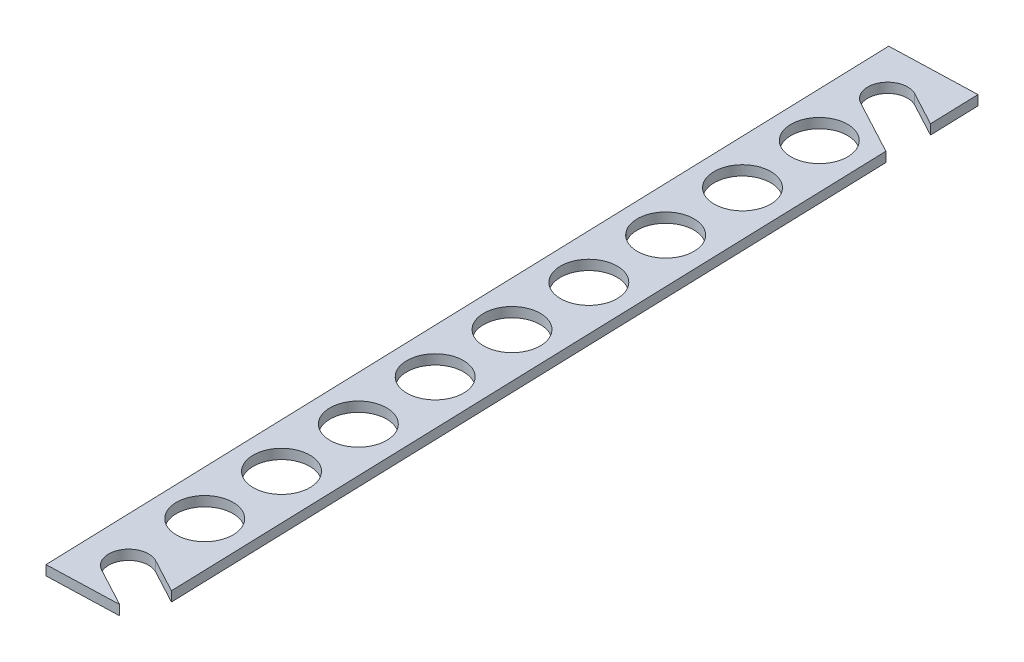
ISO-10303-21;
HEADER;
FILE_DESCRIPTION(('STEP AP214'),'2;1');
FILE_NAME('part.step','',(''),(''),'','','');
FILE_SCHEMA(('AUTOMOTIVE_DESIGN { 1 0 10303 214 1 1 1 1 }'));
ENDSEC;
DATA;
#1=APPLICATION_CONTEXT('core data for automotive mechanical design processes');
#2=APPLICATION_PROTOCOL_DEFINITION('international standard','automotive_design',2000,#1);
#3=PRODUCT_CONTEXT('',#1,'mechanical');
#4=PRODUCT('Part','Part','',(#3));
#5=PRODUCT_RELATED_PRODUCT_CATEGORY('part','',(#4));
#6=PRODUCT_DEFINITION_FORMATION('','',#4);
#7=PRODUCT_DEFINITION_CONTEXT('part definition',#1,'design');
#8=PRODUCT_DEFINITION('design','',#6,#7);
#9=PRODUCT_DEFINITION_SHAPE('','',#8);
#10=(LENGTH_UNIT() NAMED_UNIT(*) SI_UNIT(.MILLI.,.METRE.));
#11=(NAMED_UNIT(*) PLANE_ANGLE_UNIT() SI_UNIT($,.RADIAN.));
#12=(NAMED_UNIT(*) SI_UNIT($,.STERADIAN.) SOLID_ANGLE_UNIT());
#13=UNCERTAINTY_MEASURE_WITH_UNIT(LENGTH_MEASURE(1.E-05),#10,'distance_accuracy_value','');
#14=(GEOMETRIC_REPRESENTATION_CONTEXT(3) GLOBAL_UNCERTAINTY_ASSIGNED_CONTEXT((#13)) GLOBAL_UNIT_ASSIGNED_CONTEXT((#10,
#11,#12)) REPRESENTATION_CONTEXT('',''));
#15=CARTESIAN_POINT('',(0.,0.,0.));
#16=DIRECTION('',(0.,0.,1.));
#17=DIRECTION('',(1.,0.,0.));
#18=AXIS2_PLACEMENT_3D('',#15,#16,#17);
#19=CARTESIAN_POINT('',(2.03043209974553,1.5875,63.99656754575));
#20=DIRECTION('',(0.,1.,0.));
#21=DIRECTION('',(0.,0.,1.));
#22=AXIS2_PLACEMENT_3D('',#19,#20,#21);
#23=PLANE('',#22);
#24=CARTESIAN_POINT('',(1.22077445042455,1.5875,38.4772160489935));
#25=DIRECTION('',(0.,1.,0.));
#26=DIRECTION('',(0.,0.,1.));
#27=AXIS2_PLACEMENT_3D('',#24,#25,#26);
#28=CIRCLE('',#27,4.57199999999983);
#29=CARTESIAN_POINT('',(1.22077445042455,1.5875,43.0492160489934));
#30=VERTEX_POINT('',#29);
#31=EDGE_CURVE('E342',#30,#30,#28,.T.);
#32=ORIENTED_EDGE('',*,*,#31,.F.);
#33=EDGE_LOOP('',(#32));
#34=FACE_BOUND('',#33,.T.);
#35=CARTESIAN_POINT('',(0.406924816808177,1.5875,12.8257386829977));
#36=DIRECTION('',(0.,1.,0.));
#37=DIRECTION('',(0.,0.,1.));
#38=AXIS2_PLACEMENT_3D('',#35,#36,#37);
#39=CIRCLE('',#38,4.57199999999941);
#40=CARTESIAN_POINT('',(0.406924816808177,1.5875,17.3977386829971));
#41=VERTEX_POINT('',#40);
#42=EDGE_CURVE('E358',#41,#41,#39,.T.);
#43=ORIENTED_EDGE('',*,*,#42,.F.);
#44=EDGE_LOOP('',(#43));
#45=FACE_BOUND('',#44,.T.);
#46=CARTESIAN_POINT('',(-0.406924816808185,1.5875,-12.8257386829979));
#47=DIRECTION('',(0.,1.,0.));
#48=DIRECTION('',(0.,0.,1.));
#49=AXIS2_PLACEMENT_3D('',#46,#47,#48);
#50=CIRCLE('',#49,4.57199999999983);
#51=CARTESIAN_POINT('',(-0.406924816808185,1.5875,-8.25373868299808));
#52=VERTEX_POINT('',#51);
#53=EDGE_CURVE('E374',#52,#52,#50,.T.);
#54=ORIENTED_EDGE('',*,*,#53,.F.);
#55=EDGE_LOOP('',(#54));
#56=FACE_BOUND('',#55,.T.);
#57=CARTESIAN_POINT('',(-1.22077445042455,1.5875,-38.4772160489937));
#58=DIRECTION('',(0.,1.,0.));
#59=DIRECTION('',(0.,0.,1.));
#60=AXIS2_PLACEMENT_3D('',#57,#58,#59);
#61=CIRCLE('',#60,4.57199999999983);
#62=CARTESIAN_POINT('',(-1.22077445042455,1.5875,-33.9052160489939));
#63=VERTEX_POINT('',#62);
#64=EDGE_CURVE('E390',#63,#63,#61,.T.);
#65=ORIENTED_EDGE('',*,*,#64,.F.);
#66=EDGE_LOOP('',(#65));
#67=FACE_BOUND('',#66,.T.);
#68=DIRECTION('',(0.0317112466545512,0.,0.999497071949495));
#69=VECTOR('',#68,1.);
#70=CARTESIAN_POINT('',(-9.22827801964852,1.5875,-70.1213952260477));
#71=LINE('',#70,#69);
#72=CARTESIAN_POINT('',(-9.22827801964852,1.5875,-70.1213952260477));
#73=VERTEX_POINT('',#72);
#74=CARTESIAN_POINT('',(-4.76468098764465,1.5875,70.5653526792112));
#75=VERTEX_POINT('',#74);
#76=EDGE_CURVE('E191',#73,#75,#71,.T.);
#77=ORIENTED_EDGE('',*,*,#76,.T.);
#78=DIRECTION('',(0.999497071949495,0.,-0.0317112466545519));
#79=VECTOR('',#78,1.);
#80=CARTESIAN_POINT('',(6.77643436913113,1.5875,70.1991853676517));
#81=LINE('',#80,#79);
#82=CARTESIAN_POINT('',(6.77643436913113,1.5875,70.1991853676517));
#83=VERTEX_POINT('',#82);
#84=EDGE_CURVE('E108',#75,#83,#81,.T.);
#85=ORIENTED_EDGE('',*,*,#84,.T.);
#86=DIRECTION('',(-0.881445478643692,0.,-0.472285790786249));
#87=VECTOR('',#86,1.);
#88=CARTESIAN_POINT('',(0.50693259582727,1.5875,66.8399343707587));
#89=LINE('',#88,#87);
#90=CARTESIAN_POINT('',(0.50693259582727,1.5875,66.8399343707587));
#91=VERTEX_POINT('',#90);
#92=EDGE_CURVE('E225',#83,#91,#89,.T.);
#93=ORIENTED_EDGE('',*,*,#92,.T.);
#94=CARTESIAN_POINT('',(2.03043209974553,1.5875,63.99656754575));
#95=DIRECTION('',(0.,-1.,0.));
#96=DIRECTION('',(0.,0.,1.));
#97=AXIS2_PLACEMENT_3D('',#94,#95,#96);
#98=CIRCLE('',#97,3.22579999999994);
#99=CARTESIAN_POINT('',(3.55393160366379,1.5875,61.1532007207412));
#100=VERTEX_POINT('',#99);
#101=EDGE_CURVE('E245',#91,#100,#98,.T.);
#102=ORIENTED_EDGE('',*,*,#101,.T.);
#103=DIRECTION('',(0.881445478643711,0.,0.472285790786214));
#104=VECTOR('',#103,1.);
#105=CARTESIAN_POINT('',(3.55393160366379,1.5875,61.1532007207412));
#106=LINE('',#105,#104);
#107=CARTESIAN_POINT('',(9.03695198303303,1.5875,64.0910484702718));
#108=VERTEX_POINT('',#107);
#109=EDGE_CURVE('E241',#100,#108,#106,.T.);
#110=ORIENTED_EDGE('',*,*,#109,.T.);
#111=DIRECTION('',(-0.0317112466545511,0.,-0.999497071949495));
#112=VECTOR('',#111,1.);
#113=CARTESIAN_POINT('',(5.25259926260422,1.5875,-55.1868059924398));
#114=LINE('',#113,#112);
#115=CARTESIAN_POINT('',(5.25259926260422,1.5875,-55.1868059924398));
#116=VERTEX_POINT('',#115);
#117=EDGE_CURVE('E244',#108,#116,#114,.T.);
#118=ORIENTED_EDGE('',*,*,#117,.T.);
#119=DIRECTION('',(-0.881445478643702,0.,-0.47228579078623));
#120=VECTOR('',#119,1.);
#121=CARTESIAN_POINT('',(-3.51365832041251,1.5875,-59.8838394393655));
#122=LINE('',#121,#120);
#123=CARTESIAN_POINT('',(-3.51365832041251,1.5875,-59.8838394393655));
#124=VERTEX_POINT('',#123);
#125=EDGE_CURVE('E250',#116,#124,#122,.T.);
#126=ORIENTED_EDGE('',*,*,#125,.T.);
#127=CARTESIAN_POINT('',(-1.99015881649426,1.5875,-62.7272062643744));
#128=DIRECTION('',(0.,-1.,0.));
#129=DIRECTION('',(0.,0.,1.));
#130=AXIS2_PLACEMENT_3D('',#127,#128,#129);
#131=CIRCLE('',#130,3.22580000000024);
#132=CARTESIAN_POINT('',(-0.466659312575622,1.5875,-65.5705730893834));
#133=VERTEX_POINT('',#132);
#134=EDGE_CURVE('E136',#124,#133,#131,.T.);
#135=ORIENTED_EDGE('',*,*,#134,.T.);
#136=DIRECTION('',(0.881445478643709,0.,0.472285790786217));
#137=VECTOR('',#136,1.);
#138=CARTESIAN_POINT('',(-0.466659312575564,1.5875,-65.5705730893835));
#139=LINE('',#138,#137);
#140=CARTESIAN_POINT('',(5.01636106679323,1.5875,-62.6327253398531));
#141=VERTEX_POINT('',#140);
#142=EDGE_CURVE('E130',#133,#141,#139,.T.);
#143=ORIENTED_EDGE('',*,*,#142,.T.);
#144=DIRECTION('',(-0.0317112466546072,0.,-0.999497071949493));
#145=VECTOR('',#144,1.);
#146=CARTESIAN_POINT('',(4.7646809876442,1.5875,-70.5653526792114));
#147=LINE('',#146,#145);
#148=CARTESIAN_POINT('',(4.7646809876442,1.5875,-70.5653526792114));
#149=VERTEX_POINT('',#148);
#150=EDGE_CURVE('E134',#141,#149,#147,.T.);
#151=ORIENTED_EDGE('',*,*,#150,.T.);
#152=DIRECTION('',(-0.999497071949495,0.,0.0317112466545512));
#153=VECTOR('',#152,1.);
#154=CARTESIAN_POINT('',(4.7646809876442,1.5875,-70.5653526792114));
#155=LINE('',#154,#153);
#156=EDGE_CURVE('E56',#149,#73,#155,.T.);
#157=ORIENTED_EDGE('',*,*,#156,.T.);
#158=EDGE_LOOP('',(#77,#85,#93,#102,#110,#118,#126,#135,#143,#151,#157));
#159=FACE_BOUND('',#158,.T.);
#160=CARTESIAN_POINT('',(-1.62769926723274,1.5875,-51.3029547319917));
#161=DIRECTION('',(0.,1.,0.));
#162=DIRECTION('',(0.,0.,1.));
#163=AXIS2_PLACEMENT_3D('',#160,#161,#162);
#164=CIRCLE('',#163,4.57199999999983);
#165=CARTESIAN_POINT('',(-1.62769926723274,1.5875,-46.7309547319918));
#166=VERTEX_POINT('',#165);
#167=EDGE_CURVE('E164',#166,#166,#164,.T.);
#168=ORIENTED_EDGE('',*,*,#167,.F.);
#169=EDGE_LOOP('',(#168));
#170=FACE_BOUND('',#169,.T.);
#171=CARTESIAN_POINT('',(-0.813849633616369,1.5875,-25.6514773659958));
#172=DIRECTION('',(0.,1.,0.));
#173=DIRECTION('',(0.,0.,1.));
#174=AXIS2_PLACEMENT_3D('',#171,#172,#173);
#175=CIRCLE('',#174,4.57199999999983);
#176=CARTESIAN_POINT('',(-0.813849633616369,1.5875,-21.079477365996));
#177=VERTEX_POINT('',#176);
#178=EDGE_CURVE('E382',#177,#177,#175,.T.);
#179=ORIENTED_EDGE('',*,*,#178,.F.);
#180=EDGE_LOOP('',(#179));
#181=FACE_BOUND('',#180,.T.);
#182=CARTESIAN_POINT('',(0.,1.5875,0.));
#183=DIRECTION('',(0.,1.,0.));
#184=DIRECTION('',(0.,0.,1.));
#185=AXIS2_PLACEMENT_3D('',#182,#183,#184);
#186=CIRCLE('',#185,4.57199999999983);
#187=CARTESIAN_POINT('',(0.,1.5875,4.57199999999983));
#188=VERTEX_POINT('',#187);
#189=EDGE_CURVE('E366',#188,#188,#186,.T.);
#190=ORIENTED_EDGE('',*,*,#189,.F.);
#191=EDGE_LOOP('',(#190));
#192=FACE_BOUND('',#191,.T.);
#193=CARTESIAN_POINT('',(0.813849633616362,1.5875,25.6514773659956));
#194=DIRECTION('',(0.,1.,0.));
#195=DIRECTION('',(0.,0.,1.));
#196=AXIS2_PLACEMENT_3D('',#193,#194,#195);
#197=CIRCLE('',#196,4.57199999999983);
#198=CARTESIAN_POINT('',(0.813849633616362,1.5875,30.2234773659954));
#199=VERTEX_POINT('',#198);
#200=EDGE_CURVE('E350',#199,#199,#197,.T.);
#201=ORIENTED_EDGE('',*,*,#200,.F.);
#202=EDGE_LOOP('',(#201));
#203=FACE_BOUND('',#202,.T.);
#204=CARTESIAN_POINT('',(1.62769926723273,1.5875,51.3029547319914));
#205=DIRECTION('',(0.,1.,0.));
#206=DIRECTION('',(0.,0.,1.));
#207=AXIS2_PLACEMENT_3D('',#204,#205,#206);
#208=CIRCLE('',#207,4.57199999999983);
#209=CARTESIAN_POINT('',(1.62769926723273,1.5875,55.8749547319913));
#210=VERTEX_POINT('',#209);
#211=EDGE_CURVE('E330',#210,#210,#208,.T.);
#212=ORIENTED_EDGE('',*,*,#211,.F.);
#213=EDGE_LOOP('',(#212));
#214=FACE_BOUND('',#213,.T.);
#215=ADVANCED_FACE('F38',(#34,#45,#56,#67,#159,#170,#181,#192,#203,#214),#23,.T.);
#216=CARTESIAN_POINT('',(2.03043209974553,0.,63.99656754575));
#217=DIRECTION('',(0.,1.,0.));
#218=DIRECTION('',(0.,0.,1.));
#219=AXIS2_PLACEMENT_3D('',#216,#217,#218);
#220=PLANE('',#219);
#221=DIRECTION('',(0.0317112466545512,0.,0.999497071949495));
#222=VECTOR('',#221,1.);
#223=CARTESIAN_POINT('',(-9.22827801964852,0.,-70.1213952260477));
#224=LINE('',#223,#222);
#225=CARTESIAN_POINT('',(-9.22827801964852,0.,-70.1213952260477));
#226=VERTEX_POINT('',#225);
#227=CARTESIAN_POINT('',(-4.76468098764465,0.,70.5653526792112));
#228=VERTEX_POINT('',#227);
#229=EDGE_CURVE('E159',#226,#228,#224,.T.);
#230=ORIENTED_EDGE('',*,*,#229,.F.);
#231=DIRECTION('',(-0.999497071949495,0.,0.0317112466545512));
#232=VECTOR('',#231,1.);
#233=CARTESIAN_POINT('',(4.7646809876442,0.,-70.5653526792114));
#234=LINE('',#233,#232);
#235=CARTESIAN_POINT('',(4.7646809876442,0.,-70.5653526792114));
#236=VERTEX_POINT('',#235);
#237=EDGE_CURVE('E100',#236,#226,#234,.T.);
#238=ORIENTED_EDGE('',*,*,#237,.F.);
#239=DIRECTION('',(-0.0317112466546072,0.,-0.999497071949493));
#240=VECTOR('',#239,1.);
#241=CARTESIAN_POINT('',(4.7646809876442,0.,-70.5653526792114));
#242=LINE('',#241,#240);
#243=CARTESIAN_POINT('',(5.01636106679323,0.,-62.6327253398531));
#244=VERTEX_POINT('',#243);
#245=EDGE_CURVE('E94',#244,#236,#242,.T.);
#246=ORIENTED_EDGE('',*,*,#245,.F.);
#247=DIRECTION('',(0.881445478643709,0.,0.472285790786217));
#248=VECTOR('',#247,1.);
#249=CARTESIAN_POINT('',(-0.466659312575564,0.,-65.5705730893835));
#250=LINE('',#249,#248);
#251=CARTESIAN_POINT('',(-0.466659312575622,0.,-65.5705730893834));
#252=VERTEX_POINT('',#251);
#253=EDGE_CURVE('E145',#252,#244,#250,.T.);
#254=ORIENTED_EDGE('',*,*,#253,.F.);
#255=CARTESIAN_POINT('',(-1.99015881649426,0.,-62.7272062643744));
#256=DIRECTION('',(0.,-1.,0.));
#257=DIRECTION('',(0.,0.,1.));
#258=AXIS2_PLACEMENT_3D('',#255,#256,#257);
#259=CIRCLE('',#258,3.22580000000024);
#260=CARTESIAN_POINT('',(-3.51365832041251,0.,-59.8838394393655));
#261=VERTEX_POINT('',#260);
#262=EDGE_CURVE('E182',#261,#252,#259,.T.);
#263=ORIENTED_EDGE('',*,*,#262,.F.);
#264=DIRECTION('',(-0.881445478643702,0.,-0.47228579078623));
#265=VECTOR('',#264,1.);
#266=CARTESIAN_POINT('',(-3.51365832041251,0.,-59.8838394393655));
#267=LINE('',#266,#265);
#268=CARTESIAN_POINT('',(5.25259926260422,0.,-55.1868059924398));
#269=VERTEX_POINT('',#268);
#270=EDGE_CURVE('E179',#269,#261,#267,.T.);
#271=ORIENTED_EDGE('',*,*,#270,.F.);
#272=DIRECTION('',(-0.0317112466545511,0.,-0.999497071949495));
#273=VECTOR('',#272,1.);
#274=CARTESIAN_POINT('',(5.25259926260422,0.,-55.1868059924398));
#275=LINE('',#274,#273);
#276=CARTESIAN_POINT('',(9.03695198303303,0.,64.0910484702718));
#277=VERTEX_POINT('',#276);
#278=EDGE_CURVE('E176',#277,#269,#275,.T.);
#279=ORIENTED_EDGE('',*,*,#278,.F.);
#280=DIRECTION('',(0.881445478643711,0.,0.472285790786214));
#281=VECTOR('',#280,1.);
#282=CARTESIAN_POINT('',(3.55393160366379,0.,61.1532007207412));
#283=LINE('',#282,#281);
#284=CARTESIAN_POINT('',(3.55393160366379,0.,61.1532007207412));
#285=VERTEX_POINT('',#284);
#286=EDGE_CURVE('E173',#285,#277,#283,.T.);
#287=ORIENTED_EDGE('',*,*,#286,.F.);
#288=CARTESIAN_POINT('',(2.03043209974553,0.,63.99656754575));
#289=DIRECTION('',(0.,-1.,0.));
#290=DIRECTION('',(0.,0.,1.));
#291=AXIS2_PLACEMENT_3D('',#288,#289,#290);
#292=CIRCLE('',#291,3.22579999999994);
#293=CARTESIAN_POINT('',(0.50693259582727,0.,66.8399343707587));
#294=VERTEX_POINT('',#293);
#295=EDGE_CURVE('E170',#294,#285,#292,.T.);
#296=ORIENTED_EDGE('',*,*,#295,.F.);
#297=DIRECTION('',(-0.881445478643692,0.,-0.472285790786249));
#298=VECTOR('',#297,1.);
#299=CARTESIAN_POINT('',(0.50693259582727,0.,66.8399343707587));
#300=LINE('',#299,#298);
#301=CARTESIAN_POINT('',(6.77643436913113,0.,70.1991853676517));
#302=VERTEX_POINT('',#301);
#303=EDGE_CURVE('E167',#302,#294,#300,.T.);
#304=ORIENTED_EDGE('',*,*,#303,.F.);
#305=DIRECTION('',(0.999497071949495,0.,-0.0317112466545519));
#306=VECTOR('',#305,1.);
#307=CARTESIAN_POINT('',(6.77643436913113,0.,70.1991853676517));
#308=LINE('',#307,#306);
#309=EDGE_CURVE('E163',#228,#302,#308,.T.);
#310=ORIENTED_EDGE('',*,*,#309,.F.);
#311=EDGE_LOOP('',(#230,#238,#246,#254,#263,#271,#279,#287,#296,#304,#310));
#312=FACE_BOUND('',#311,.T.);
#313=CARTESIAN_POINT('',(-1.62769926723274,0.,-51.3029547319917));
#314=DIRECTION('',(0.,1.,0.));
#315=DIRECTION('',(0.,0.,1.));
#316=AXIS2_PLACEMENT_3D('',#313,#314,#315);
#317=CIRCLE('',#316,4.57199999999983);
#318=CARTESIAN_POINT('',(-1.62769926723274,0.,-46.7309547319918));
#319=VERTEX_POINT('',#318);
#320=EDGE_CURVE('E394',#319,#319,#317,.T.);
#321=ORIENTED_EDGE('',*,*,#320,.T.);
#322=EDGE_LOOP('',(#321));
#323=FACE_BOUND('',#322,.T.);
#324=CARTESIAN_POINT('',(-1.22077445042455,0.,-38.4772160489937));
#325=DIRECTION('',(0.,1.,0.));
#326=DIRECTION('',(0.,0.,1.));
#327=AXIS2_PLACEMENT_3D('',#324,#325,#326);
#328=CIRCLE('',#327,4.57199999999983);
#329=CARTESIAN_POINT('',(-1.22077445042455,0.,-33.9052160489939));
#330=VERTEX_POINT('',#329);
#331=EDGE_CURVE('E386',#330,#330,#328,.T.);
#332=ORIENTED_EDGE('',*,*,#331,.T.);
#333=EDGE_LOOP('',(#332));
#334=FACE_BOUND('',#333,.T.);
#335=CARTESIAN_POINT('',(-0.813849633616369,0.,-25.6514773659958));
#336=DIRECTION('',(0.,1.,0.));
#337=DIRECTION('',(0.,0.,1.));
#338=AXIS2_PLACEMENT_3D('',#335,#336,#337);
#339=CIRCLE('',#338,4.57199999999983);
#340=CARTESIAN_POINT('',(-0.813849633616369,0.,-21.079477365996));
#341=VERTEX_POINT('',#340);
#342=EDGE_CURVE('E378',#341,#341,#339,.T.);
#343=ORIENTED_EDGE('',*,*,#342,.T.);
#344=EDGE_LOOP('',(#343));
#345=FACE_BOUND('',#344,.T.);
#346=CARTESIAN_POINT('',(-0.406924816808185,0.,-12.8257386829979));
#347=DIRECTION('',(0.,1.,0.));
#348=DIRECTION('',(0.,0.,1.));
#349=AXIS2_PLACEMENT_3D('',#346,#347,#348);
#350=CIRCLE('',#349,4.57199999999983);
#351=CARTESIAN_POINT('',(-0.406924816808185,0.,-8.25373868299808));
#352=VERTEX_POINT('',#351);
#353=EDGE_CURVE('E370',#352,#352,#350,.T.);
#354=ORIENTED_EDGE('',*,*,#353,.T.);
#355=EDGE_LOOP('',(#354));
#356=FACE_BOUND('',#355,.T.);
#357=CARTESIAN_POINT('',(0.,0.,0.));
#358=DIRECTION('',(0.,1.,0.));
#359=DIRECTION('',(0.,0.,1.));
#360=AXIS2_PLACEMENT_3D('',#357,#358,#359);
#361=CIRCLE('',#360,4.57199999999983);
#362=CARTESIAN_POINT('',(0.,0.,4.57199999999983));
#363=VERTEX_POINT('',#362);
#364=EDGE_CURVE('E362',#363,#363,#361,.T.);
#365=ORIENTED_EDGE('',*,*,#364,.T.);
#366=EDGE_LOOP('',(#365));
#367=FACE_BOUND('',#366,.T.);
#368=CARTESIAN_POINT('',(0.406924816808177,0.,12.8257386829977));
#369=DIRECTION('',(0.,1.,0.));
#370=DIRECTION('',(0.,0.,1.));
#371=AXIS2_PLACEMENT_3D('',#368,#369,#370);
#372=CIRCLE('',#371,4.57199999999941);
#373=CARTESIAN_POINT('',(0.406924816808177,0.,17.3977386829971));
#374=VERTEX_POINT('',#373);
#375=EDGE_CURVE('E354',#374,#374,#372,.T.);
#376=ORIENTED_EDGE('',*,*,#375,.T.);
#377=EDGE_LOOP('',(#376));
#378=FACE_BOUND('',#377,.T.);
#379=CARTESIAN_POINT('',(0.813849633616362,0.,25.6514773659956));
#380=DIRECTION('',(0.,1.,0.));
#381=DIRECTION('',(0.,0.,1.));
#382=AXIS2_PLACEMENT_3D('',#379,#380,#381);
#383=CIRCLE('',#382,4.57199999999983);
#384=CARTESIAN_POINT('',(0.813849633616362,0.,30.2234773659954));
#385=VERTEX_POINT('',#384);
#386=EDGE_CURVE('E346',#385,#385,#383,.T.);
#387=ORIENTED_EDGE('',*,*,#386,.T.);
#388=EDGE_LOOP('',(#387));
#389=FACE_BOUND('',#388,.T.);
#390=CARTESIAN_POINT('',(1.22077445042455,0.,38.4772160489935));
#391=DIRECTION('',(0.,1.,0.));
#392=DIRECTION('',(0.,0.,1.));
#393=AXIS2_PLACEMENT_3D('',#390,#391,#392);
#394=CIRCLE('',#393,4.57199999999983);
#395=CARTESIAN_POINT('',(1.22077445042455,0.,43.0492160489934));
#396=VERTEX_POINT('',#395);
#397=EDGE_CURVE('E339',#396,#396,#394,.T.);
#398=ORIENTED_EDGE('',*,*,#397,.T.);
#399=EDGE_LOOP('',(#398));
#400=FACE_BOUND('',#399,.T.);
#401=CARTESIAN_POINT('',(1.62769926723273,0.,51.3029547319914));
#402=DIRECTION('',(0.,1.,0.));
#403=DIRECTION('',(0.,0.,1.));
#404=AXIS2_PLACEMENT_3D('',#401,#402,#403);
#405=CIRCLE('',#404,4.57199999999983);
#406=CARTESIAN_POINT('',(1.62769926723273,0.,55.8749547319913));
#407=VERTEX_POINT('',#406);
#408=EDGE_CURVE('E333',#407,#407,#405,.T.);
#409=ORIENTED_EDGE('',*,*,#408,.T.);
#410=EDGE_LOOP('',(#409));
#411=FACE_BOUND('',#410,.T.);
#412=ADVANCED_FACE('F229',(#312,#323,#334,#345,#356,#367,#378,#389,#400,#411),#220,.F.);
#413=CARTESIAN_POINT('',(-9.22827801964852,1.5875,-70.1213952260477));
#414=DIRECTION('',(0.999497071949495,0.,-0.0317112466545511));
#415=DIRECTION('',(-0.0317112466545512,0.,-0.999497071949495));
#416=AXIS2_PLACEMENT_3D('',#413,#414,#415);
#417=PLANE('',#416);
#418=ORIENTED_EDGE('',*,*,#229,.T.);
#419=DIRECTION('',(0.,-1.,0.));
#420=VECTOR('',#419,1.);
#421=CARTESIAN_POINT('',(-4.76468098764465,1.5875,70.5653526792112));
#422=LINE('',#421,#420);
#423=EDGE_CURVE('E11',#75,#228,#422,.T.);
#424=ORIENTED_EDGE('',*,*,#423,.F.);
#425=ORIENTED_EDGE('',*,*,#76,.F.);
#426=DIRECTION('',(0.,-1.,0.));
#427=VECTOR('',#426,1.);
#428=CARTESIAN_POINT('',(-9.22827801964852,1.5875,-70.1213952260477));
#429=LINE('',#428,#427);
#430=EDGE_CURVE('E155',#73,#226,#429,.T.);
#431=ORIENTED_EDGE('',*,*,#430,.T.);
#432=EDGE_LOOP('',(#418,#424,#425,#431));
#433=FACE_BOUND('',#432,.T.);
#434=ADVANCED_FACE('F40',(#433),#417,.F.);
#435=CARTESIAN_POINT('',(6.77643436913113,1.5875,70.1991853676517));
#436=DIRECTION('',(-0.0317112466545519,0.,-0.999497071949495));
#437=DIRECTION('',(-0.999497071949495,0.,0.0317112466545519));
#438=AXIS2_PLACEMENT_3D('',#435,#436,#437);
#439=PLANE('',#438);
#440=ORIENTED_EDGE('',*,*,#309,.T.);
#441=DIRECTION('',(0.,-1.,0.));
#442=VECTOR('',#441,1.);
#443=CARTESIAN_POINT('',(6.77643436913113,1.5875,70.1991853676517));
#444=LINE('',#443,#442);
#445=EDGE_CURVE('E48',#83,#302,#444,.T.);
#446=ORIENTED_EDGE('',*,*,#445,.F.);
#447=ORIENTED_EDGE('',*,*,#84,.F.);
#448=ORIENTED_EDGE('',*,*,#423,.T.);
#449=EDGE_LOOP('',(#440,#446,#447,#448));
#450=FACE_BOUND('',#449,.T.);
#451=ADVANCED_FACE('F577',(#450),#439,.F.);
#452=CARTESIAN_POINT('',(0.50693259582727,1.5875,66.8399343707587));
#453=DIRECTION('',(-0.472285790786249,0.,0.881445478643692));
#454=DIRECTION('',(0.881445478643692,0.,0.472285790786249));
#455=AXIS2_PLACEMENT_3D('',#452,#453,#454);
#456=PLANE('',#455);
#457=ORIENTED_EDGE('',*,*,#303,.T.);
#458=DIRECTION('',(0.,-1.,0.));
#459=VECTOR('',#458,1.);
#460=CARTESIAN_POINT('',(0.50693259582727,1.5875,66.8399343707587));
#461=LINE('',#460,#459);
#462=EDGE_CURVE('E214',#91,#294,#461,.T.);
#463=ORIENTED_EDGE('',*,*,#462,.F.);
#464=ORIENTED_EDGE('',*,*,#92,.F.);
#465=ORIENTED_EDGE('',*,*,#445,.T.);
#466=EDGE_LOOP('',(#457,#463,#464,#465));
#467=FACE_BOUND('',#466,.T.);
#468=ADVANCED_FACE('F223',(#467),#456,.F.);
#469=CARTESIAN_POINT('',(2.03043209974553,1.5875,63.99656754575));
#470=DIRECTION('',(0.,-1.,0.));
#471=DIRECTION('',(0.,0.,-1.));
#472=AXIS2_PLACEMENT_3D('',#469,#470,#471);
#473=CYLINDRICAL_SURFACE('',#472,3.22579999999994);
#474=ORIENTED_EDGE('',*,*,#295,.T.);
#475=DIRECTION('',(0.,-1.,0.));
#476=VECTOR('',#475,1.);
#477=CARTESIAN_POINT('',(3.55393160366379,1.5875,61.1532007207412));
#478=LINE('',#477,#476);
#479=EDGE_CURVE('E210',#100,#285,#478,.T.);
#480=ORIENTED_EDGE('',*,*,#479,.F.);
#481=ORIENTED_EDGE('',*,*,#101,.F.);
#482=ORIENTED_EDGE('',*,*,#462,.T.);
#483=EDGE_LOOP('',(#474,#480,#481,#482));
#484=FACE_BOUND('',#483,.T.);
#485=ADVANCED_FACE('F235',(#484),#473,.F.);
#486=CARTESIAN_POINT('',(3.55393160366379,1.5875,61.1532007207412));
#487=DIRECTION('',(0.472285790786214,0.,-0.881445478643711));
#488=DIRECTION('',(-0.881445478643711,0.,-0.472285790786214));
#489=AXIS2_PLACEMENT_3D('',#486,#487,#488);
#490=PLANE('',#489);
#491=ORIENTED_EDGE('',*,*,#286,.T.);
#492=DIRECTION('',(0.,-1.,0.));
#493=VECTOR('',#492,1.);
#494=CARTESIAN_POINT('',(9.03695198303303,1.5875,64.0910484702718));
#495=LINE('',#494,#493);
#496=EDGE_CURVE('E206',#108,#277,#495,.T.);
#497=ORIENTED_EDGE('',*,*,#496,.F.);
#498=ORIENTED_EDGE('',*,*,#109,.F.);
#499=ORIENTED_EDGE('',*,*,#479,.T.);
#500=EDGE_LOOP('',(#491,#497,#498,#499));
#501=FACE_BOUND('',#500,.T.);
#502=ADVANCED_FACE('F239',(#501),#490,.F.);
#503=CARTESIAN_POINT('',(5.25259926260422,1.5875,-55.1868059924398));
#504=DIRECTION('',(-0.999497071949495,0.,0.0317112466545511));
#505=DIRECTION('',(0.0317112466545511,0.,0.999497071949495));
#506=AXIS2_PLACEMENT_3D('',#503,#504,#505);
#507=PLANE('',#506);
#508=ORIENTED_EDGE('',*,*,#278,.T.);
#509=DIRECTION('',(0.,-1.,0.));
#510=VECTOR('',#509,1.);
#511=CARTESIAN_POINT('',(5.25259926260422,1.5875,-55.1868059924398));
#512=LINE('',#511,#510);
#513=EDGE_CURVE('E202',#116,#269,#512,.T.);
#514=ORIENTED_EDGE('',*,*,#513,.F.);
#515=ORIENTED_EDGE('',*,*,#117,.F.);
#516=ORIENTED_EDGE('',*,*,#496,.T.);
#517=EDGE_LOOP('',(#508,#514,#515,#516));
#518=FACE_BOUND('',#517,.T.);
#519=ADVANCED_FACE('F543',(#518),#507,.F.);
#520=CARTESIAN_POINT('',(-3.51365832041251,1.5875,-59.8838394393655));
#521=DIRECTION('',(-0.47228579078623,0.,0.881445478643702));
#522=DIRECTION('',(0.881445478643702,0.,0.472285790786231));
#523=AXIS2_PLACEMENT_3D('',#520,#521,#522);
#524=PLANE('',#523);
#525=ORIENTED_EDGE('',*,*,#270,.T.);
#526=DIRECTION('',(0.,-1.,0.));
#527=VECTOR('',#526,1.);
#528=CARTESIAN_POINT('',(-3.51365832041251,1.5875,-59.8838394393655));
#529=LINE('',#528,#527);
#530=EDGE_CURVE('E198',#124,#261,#529,.T.);
#531=ORIENTED_EDGE('',*,*,#530,.F.);
#532=ORIENTED_EDGE('',*,*,#125,.F.);
#533=ORIENTED_EDGE('',*,*,#513,.T.);
#534=EDGE_LOOP('',(#525,#531,#532,#533));
#535=FACE_BOUND('',#534,.T.);
#536=ADVANCED_FACE('F265',(#535),#524,.F.);
#537=CARTESIAN_POINT('',(-1.99015881649426,1.5875,-62.7272062643744));
#538=DIRECTION('',(0.,-1.,0.));
#539=DIRECTION('',(0.,0.,-1.));
#540=AXIS2_PLACEMENT_3D('',#537,#538,#539);
#541=CYLINDRICAL_SURFACE('',#540,3.22580000000024);
#542=ORIENTED_EDGE('',*,*,#262,.T.);
#543=DIRECTION('',(0.,-1.,0.));
#544=VECTOR('',#543,1.);
#545=CARTESIAN_POINT('',(-0.466659312575622,1.5875,-65.5705730893834));
#546=LINE('',#545,#544);
#547=EDGE_CURVE('E147',#133,#252,#546,.T.);
#548=ORIENTED_EDGE('',*,*,#547,.F.);
#549=ORIENTED_EDGE('',*,*,#134,.F.);
#550=ORIENTED_EDGE('',*,*,#530,.T.);
#551=EDGE_LOOP('',(#542,#548,#549,#550));
#552=FACE_BOUND('',#551,.T.);
#553=ADVANCED_FACE('F269',(#552),#541,.F.);
#554=CARTESIAN_POINT('',(-0.466659312575564,1.5875,-65.5705730893835));
#555=DIRECTION('',(0.472285790786217,0.,-0.881445478643709));
#556=DIRECTION('',(-0.881445478643709,0.,-0.472285790786217));
#557=AXIS2_PLACEMENT_3D('',#554,#555,#556);
#558=PLANE('',#557);
#559=ORIENTED_EDGE('',*,*,#253,.T.);
#560=DIRECTION('',(0.,-1.,0.));
#561=VECTOR('',#560,1.);
#562=CARTESIAN_POINT('',(5.01636106679323,1.5875,-62.6327253398531));
#563=LINE('',#562,#561);
#564=EDGE_CURVE('E142',#141,#244,#563,.T.);
#565=ORIENTED_EDGE('',*,*,#564,.F.);
#566=ORIENTED_EDGE('',*,*,#142,.F.);
#567=ORIENTED_EDGE('',*,*,#547,.T.);
#568=EDGE_LOOP('',(#559,#565,#566,#567));
#569=FACE_BOUND('',#568,.T.);
#570=ADVANCED_FACE('F143',(#569),#558,.F.);
#571=CARTESIAN_POINT('',(4.7646809876442,1.5875,-70.5653526792114));
#572=DIRECTION('',(-0.999497071949493,0.,0.0317112466546072));
#573=DIRECTION('',(0.0317112466546072,0.,0.999497071949493));
#574=AXIS2_PLACEMENT_3D('',#571,#572,#573);
#575=PLANE('',#574);
#576=ORIENTED_EDGE('',*,*,#245,.T.);
#577=DIRECTION('',(0.,-1.,0.));
#578=VECTOR('',#577,1.);
#579=CARTESIAN_POINT('',(4.7646809876442,1.5875,-70.5653526792114));
#580=LINE('',#579,#578);
#581=EDGE_CURVE('E148',#149,#236,#580,.T.);
#582=ORIENTED_EDGE('',*,*,#581,.F.);
#583=ORIENTED_EDGE('',*,*,#150,.F.);
#584=ORIENTED_EDGE('',*,*,#564,.T.);
#585=EDGE_LOOP('',(#576,#582,#583,#584));
#586=FACE_BOUND('',#585,.T.);
#587=ADVANCED_FACE('F150',(#586),#575,.F.);
#588=CARTESIAN_POINT('',(4.7646809876442,1.5875,-70.5653526792114));
#589=DIRECTION('',(0.0317112466545512,0.,0.999497071949495));
#590=DIRECTION('',(0.999497071949495,0.,-0.0317112466545512));
#591=AXIS2_PLACEMENT_3D('',#588,#589,#590);
#592=PLANE('',#591);
#593=ORIENTED_EDGE('',*,*,#237,.T.);
#594=ORIENTED_EDGE('',*,*,#430,.F.);
#595=ORIENTED_EDGE('',*,*,#156,.F.);
#596=ORIENTED_EDGE('',*,*,#581,.T.);
#597=EDGE_LOOP('',(#593,#594,#595,#596));
#598=FACE_BOUND('',#597,.T.);
#599=ADVANCED_FACE('F273',(#598),#592,.F.);
#600=CARTESIAN_POINT('',(-1.62769926723274,1.5875,-51.3029547319917));
#601=DIRECTION('',(0.,-1.,0.));
#602=DIRECTION('',(0.,0.,-1.));
#603=AXIS2_PLACEMENT_3D('',#600,#601,#602);
#604=CYLINDRICAL_SURFACE('',#603,4.57199999999983);
#605=ORIENTED_EDGE('',*,*,#167,.T.);
#606=EDGE_LOOP('',(#605));
#607=FACE_BOUND('',#606,.T.);
#608=ORIENTED_EDGE('',*,*,#320,.F.);
#609=EDGE_LOOP('',(#608));
#610=FACE_BOUND('',#609,.T.);
#611=ADVANCED_FACE('F275',(#607,#610),#604,.F.);
#612=CARTESIAN_POINT('',(-1.22077445042455,1.5875,-38.4772160489937));
#613=DIRECTION('',(0.,-1.,0.));
#614=DIRECTION('',(0.,0.,-1.));
#615=AXIS2_PLACEMENT_3D('',#612,#613,#614);
#616=CYLINDRICAL_SURFACE('',#615,4.57199999999983);
#617=ORIENTED_EDGE('',*,*,#64,.T.);
#618=EDGE_LOOP('',(#617));
#619=FACE_BOUND('',#618,.T.);
#620=ORIENTED_EDGE('',*,*,#331,.F.);
#621=EDGE_LOOP('',(#620));
#622=FACE_BOUND('',#621,.T.);
#623=ADVANCED_FACE('F281',(#619,#622),#616,.F.);
#624=CARTESIAN_POINT('',(-0.813849633616369,1.5875,-25.6514773659958));
#625=DIRECTION('',(0.,-1.,0.));
#626=DIRECTION('',(0.,0.,-1.));
#627=AXIS2_PLACEMENT_3D('',#624,#625,#626);
#628=CYLINDRICAL_SURFACE('',#627,4.57199999999983);
#629=ORIENTED_EDGE('',*,*,#178,.T.);
#630=EDGE_LOOP('',(#629));
#631=FACE_BOUND('',#630,.T.);
#632=ORIENTED_EDGE('',*,*,#342,.F.);
#633=EDGE_LOOP('',(#632));
#634=FACE_BOUND('',#633,.T.);
#635=ADVANCED_FACE('F297',(#631,#634),#628,.F.);
#636=CARTESIAN_POINT('',(-0.406924816808185,1.5875,-12.8257386829979));
#637=DIRECTION('',(0.,-1.,0.));
#638=DIRECTION('',(0.,0.,-1.));
#639=AXIS2_PLACEMENT_3D('',#636,#637,#638);
#640=CYLINDRICAL_SURFACE('',#639,4.57199999999983);
#641=ORIENTED_EDGE('',*,*,#53,.T.);
#642=EDGE_LOOP('',(#641));
#643=FACE_BOUND('',#642,.T.);
#644=ORIENTED_EDGE('',*,*,#353,.F.);
#645=EDGE_LOOP('',(#644));
#646=FACE_BOUND('',#645,.T.);
#647=ADVANCED_FACE('F301',(#643,#646),#640,.F.);
#648=CARTESIAN_POINT('',(0.,1.5875,0.));
#649=DIRECTION('',(0.,-1.,0.));
#650=DIRECTION('',(0.,0.,-1.));
#651=AXIS2_PLACEMENT_3D('',#648,#649,#650);
#652=CYLINDRICAL_SURFACE('',#651,4.57199999999983);
#653=ORIENTED_EDGE('',*,*,#189,.T.);
#654=EDGE_LOOP('',(#653));
#655=FACE_BOUND('',#654,.T.);
#656=ORIENTED_EDGE('',*,*,#364,.F.);
#657=EDGE_LOOP('',(#656));
#658=FACE_BOUND('',#657,.T.);
#659=ADVANCED_FACE('F305',(#655,#658),#652,.F.);
#660=CARTESIAN_POINT('',(0.406924816808177,1.5875,12.8257386829977));
#661=DIRECTION('',(0.,-1.,0.));
#662=DIRECTION('',(0.,0.,-1.));
#663=AXIS2_PLACEMENT_3D('',#660,#661,#662);
#664=CYLINDRICAL_SURFACE('',#663,4.57199999999941);
#665=ORIENTED_EDGE('',*,*,#42,.T.);
#666=EDGE_LOOP('',(#665));
#667=FACE_BOUND('',#666,.T.);
#668=ORIENTED_EDGE('',*,*,#375,.F.);
#669=EDGE_LOOP('',(#668));
#670=FACE_BOUND('',#669,.T.);
#671=ADVANCED_FACE('F309',(#667,#670),#664,.F.);
#672=CARTESIAN_POINT('',(0.813849633616362,1.5875,25.6514773659956));
#673=DIRECTION('',(0.,-1.,0.));
#674=DIRECTION('',(0.,0.,-1.));
#675=AXIS2_PLACEMENT_3D('',#672,#673,#674);
#676=CYLINDRICAL_SURFACE('',#675,4.57199999999983);
#677=ORIENTED_EDGE('',*,*,#200,.T.);
#678=EDGE_LOOP('',(#677));
#679=FACE_BOUND('',#678,.T.);
#680=ORIENTED_EDGE('',*,*,#386,.F.);
#681=EDGE_LOOP('',(#680));
#682=FACE_BOUND('',#681,.T.);
#683=ADVANCED_FACE('F313',(#679,#682),#676,.F.);
#684=CARTESIAN_POINT('',(1.22077445042455,1.5875,38.4772160489935));
#685=DIRECTION('',(0.,-1.,0.));
#686=DIRECTION('',(0.,0.,-1.));
#687=AXIS2_PLACEMENT_3D('',#684,#685,#686);
#688=CYLINDRICAL_SURFACE('',#687,4.57199999999983);
#689=ORIENTED_EDGE('',*,*,#31,.T.);
#690=EDGE_LOOP('',(#689));
#691=FACE_BOUND('',#690,.T.);
#692=ORIENTED_EDGE('',*,*,#397,.F.);
#693=EDGE_LOOP('',(#692));
#694=FACE_BOUND('',#693,.T.);
#695=ADVANCED_FACE('F317',(#691,#694),#688,.F.);
#696=CARTESIAN_POINT('',(1.62769926723273,1.5875,51.3029547319914));
#697=DIRECTION('',(0.,-1.,0.));
#698=DIRECTION('',(0.,0.,-1.));
#699=AXIS2_PLACEMENT_3D('',#696,#697,#698);
#700=CYLINDRICAL_SURFACE('',#699,4.57199999999983);
#701=ORIENTED_EDGE('',*,*,#211,.T.);
#702=EDGE_LOOP('',(#701));
#703=FACE_BOUND('',#702,.T.);
#704=ORIENTED_EDGE('',*,*,#408,.F.);
#705=EDGE_LOOP('',(#704));
#706=FACE_BOUND('',#705,.T.);
#707=ADVANCED_FACE('F321',(#703,#706),#700,.F.);
#708=CLOSED_SHELL('',(#215,#412,#434,#451,#468,#485,#502,#519,#536,#553,#570,#587,#599,#611,
#623,#635,#647,#659,#671,#683,#695,#707));
#709=MANIFOLD_SOLID_BREP('B2',#708);
#710=ADVANCED_BREP_SHAPE_REPRESENTATION('',(#18,#709),#14);
#711=SHAPE_DEFINITION_REPRESENTATION(#9,#710);
ENDSEC;
END-ISO-10303-21;
